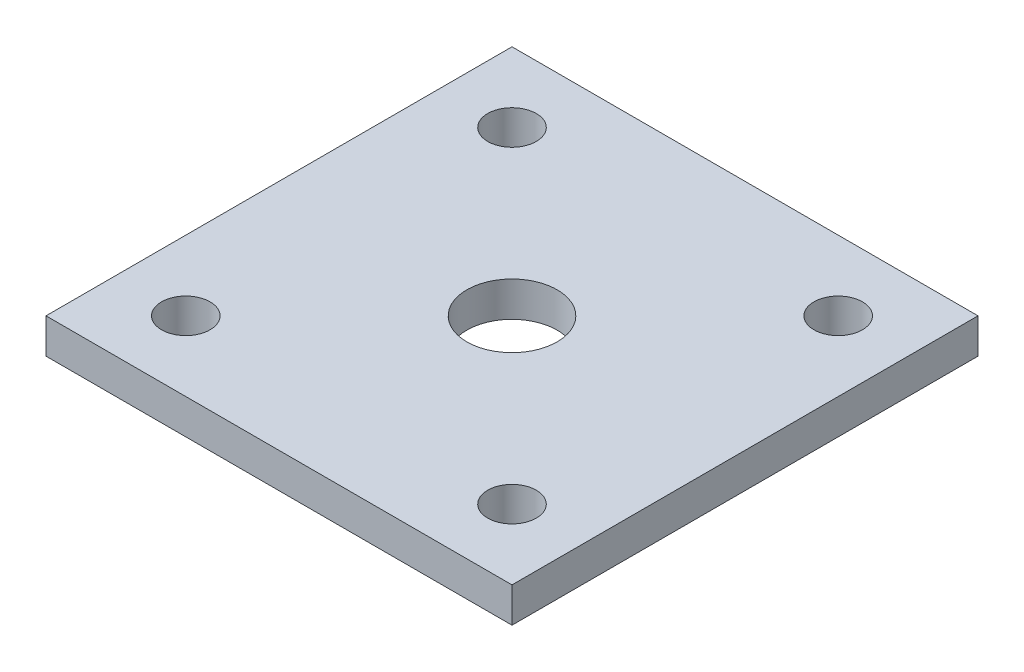
ISO-10303-21;
HEADER;
FILE_DESCRIPTION(('STEP AP214'),'2;1');
FILE_NAME('part.step','',(''),(''),'','','');
FILE_SCHEMA(('AUTOMOTIVE_DESIGN { 1 0 10303 214 1 1 1 1 }'));
ENDSEC;
DATA;
#1=APPLICATION_CONTEXT('core data for automotive mechanical design processes');
#2=APPLICATION_PROTOCOL_DEFINITION('international standard','automotive_design',2000,#1);
#3=PRODUCT_CONTEXT('',#1,'mechanical');
#4=PRODUCT('Part','Part','',(#3));
#5=PRODUCT_RELATED_PRODUCT_CATEGORY('part','',(#4));
#6=PRODUCT_DEFINITION_FORMATION('','',#4);
#7=PRODUCT_DEFINITION_CONTEXT('part definition',#1,'design');
#8=PRODUCT_DEFINITION('design','',#6,#7);
#9=PRODUCT_DEFINITION_SHAPE('','',#8);
#10=(LENGTH_UNIT() NAMED_UNIT(*) SI_UNIT(.MILLI.,.METRE.));
#11=(NAMED_UNIT(*) PLANE_ANGLE_UNIT() SI_UNIT($,.RADIAN.));
#12=(NAMED_UNIT(*) SI_UNIT($,.STERADIAN.) SOLID_ANGLE_UNIT());
#13=UNCERTAINTY_MEASURE_WITH_UNIT(LENGTH_MEASURE(1.E-05),#10,'distance_accuracy_value','');
#14=(GEOMETRIC_REPRESENTATION_CONTEXT(3) GLOBAL_UNCERTAINTY_ASSIGNED_CONTEXT((#13)) GLOBAL_UNIT_ASSIGNED_CONTEXT((#10,
#11,#12)) REPRESENTATION_CONTEXT('',''));
#15=CARTESIAN_POINT('',(0.,0.,0.));
#16=DIRECTION('',(0.,0.,1.));
#17=DIRECTION('',(1.,0.,0.));
#18=AXIS2_PLACEMENT_3D('',#15,#16,#17);
#19=CARTESIAN_POINT('',(0.,3.,0.));
#20=DIRECTION('',(0.,-1.,0.));
#21=DIRECTION('',(0.,0.,-1.));
#22=AXIS2_PLACEMENT_3D('',#19,#20,#21);
#23=PLANE('',#22);
#24=CARTESIAN_POINT('',(34.,3.,-6.));
#25=DIRECTION('',(0.,1.,0.));
#26=DIRECTION('',(0.,0.,1.));
#27=AXIS2_PLACEMENT_3D('',#24,#25,#26);
#28=CIRCLE('',#27,2.0828);
#29=CARTESIAN_POINT('',(34.,3.,-3.9172));
#30=VERTEX_POINT('',#29);
#31=EDGE_CURVE('E126',#30,#30,#28,.T.);
#32=ORIENTED_EDGE('',*,*,#31,.F.);
#33=EDGE_LOOP('',(#32));
#34=FACE_BOUND('',#33,.T.);
#35=CARTESIAN_POINT('',(6.,3.,-34.));
#36=DIRECTION('',(0.,1.,0.));
#37=DIRECTION('',(0.,0.,1.));
#38=AXIS2_PLACEMENT_3D('',#35,#36,#37);
#39=CIRCLE('',#38,2.0828);
#40=CARTESIAN_POINT('',(6.,3.,-31.9172));
#41=VERTEX_POINT('',#40);
#42=EDGE_CURVE('E114',#41,#41,#39,.T.);
#43=ORIENTED_EDGE('',*,*,#42,.F.);
#44=EDGE_LOOP('',(#43));
#45=FACE_BOUND('',#44,.T.);
#46=DIRECTION('',(0.,0.,1.));
#47=VECTOR('',#46,1.);
#48=CARTESIAN_POINT('',(0.,3.,0.));
#49=LINE('',#48,#47);
#50=CARTESIAN_POINT('',(0.,3.,-40.));
#51=VERTEX_POINT('',#50);
#52=CARTESIAN_POINT('',(0.,3.,0.));
#53=VERTEX_POINT('',#52);
#54=EDGE_CURVE('E84',#51,#53,#49,.T.);
#55=ORIENTED_EDGE('',*,*,#54,.T.);
#56=DIRECTION('',(1.,0.,0.));
#57=VECTOR('',#56,1.);
#58=CARTESIAN_POINT('',(0.,3.,0.));
#59=LINE('',#58,#57);
#60=CARTESIAN_POINT('',(40.,3.,0.));
#61=VERTEX_POINT('',#60);
#62=EDGE_CURVE('E79',#53,#61,#59,.T.);
#63=ORIENTED_EDGE('',*,*,#62,.T.);
#64=DIRECTION('',(0.,0.,-1.));
#65=VECTOR('',#64,1.);
#66=CARTESIAN_POINT('',(40.,3.,0.));
#67=LINE('',#66,#65);
#68=CARTESIAN_POINT('',(40.,3.,-40.));
#69=VERTEX_POINT('',#68);
#70=EDGE_CURVE('E82',#61,#69,#67,.T.);
#71=ORIENTED_EDGE('',*,*,#70,.T.);
#72=DIRECTION('',(-1.,0.,0.));
#73=VECTOR('',#72,1.);
#74=CARTESIAN_POINT('',(0.,3.,-40.));
#75=LINE('',#74,#73);
#76=EDGE_CURVE('E49',#69,#51,#75,.T.);
#77=ORIENTED_EDGE('',*,*,#76,.T.);
#78=EDGE_LOOP('',(#55,#63,#71,#77));
#79=FACE_BOUND('',#78,.T.);
#80=CARTESIAN_POINT('',(20.,3.,-20.));
#81=DIRECTION('',(0.,1.,0.));
#82=DIRECTION('',(0.,0.,1.));
#83=AXIS2_PLACEMENT_3D('',#80,#81,#82);
#84=CIRCLE('',#83,3.875);
#85=CARTESIAN_POINT('',(20.,3.,-16.125));
#86=VERTEX_POINT('',#85);
#87=EDGE_CURVE('E99',#86,#86,#84,.T.);
#88=ORIENTED_EDGE('',*,*,#87,.F.);
#89=EDGE_LOOP('',(#88));
#90=FACE_BOUND('',#89,.T.);
#91=CARTESIAN_POINT('',(6.,3.,-6.));
#92=DIRECTION('',(0.,1.,0.));
#93=DIRECTION('',(0.,0.,1.));
#94=AXIS2_PLACEMENT_3D('',#91,#92,#93);
#95=CIRCLE('',#94,2.0828);
#96=CARTESIAN_POINT('',(6.,3.,-3.9172));
#97=VERTEX_POINT('',#96);
#98=EDGE_CURVE('E120',#97,#97,#95,.T.);
#99=ORIENTED_EDGE('',*,*,#98,.F.);
#100=EDGE_LOOP('',(#99));
#101=FACE_BOUND('',#100,.T.);
#102=CARTESIAN_POINT('',(34.,3.,-34.));
#103=DIRECTION('',(0.,1.,0.));
#104=DIRECTION('',(0.,0.,1.));
#105=AXIS2_PLACEMENT_3D('',#102,#103,#104);
#106=CIRCLE('',#105,2.0828);
#107=CARTESIAN_POINT('',(34.,3.,-31.9172));
#108=VERTEX_POINT('',#107);
#109=EDGE_CURVE('E132',#108,#108,#106,.T.);
#110=ORIENTED_EDGE('',*,*,#109,.F.);
#111=EDGE_LOOP('',(#110));
#112=FACE_BOUND('',#111,.T.);
#113=ADVANCED_FACE('F32',(#34,#45,#79,#90,#101,#112),#23,.F.);
#114=CARTESIAN_POINT('',(0.,0.,0.));
#115=DIRECTION('',(0.,-1.,0.));
#116=DIRECTION('',(0.,0.,-1.));
#117=AXIS2_PLACEMENT_3D('',#114,#115,#116);
#118=PLANE('',#117);
#119=CARTESIAN_POINT('',(34.,0.,-6.));
#120=DIRECTION('',(0.,1.,0.));
#121=DIRECTION('',(0.,0.,1.));
#122=AXIS2_PLACEMENT_3D('',#119,#120,#121);
#123=CIRCLE('',#122,2.0828);
#124=CARTESIAN_POINT('',(34.,0.,-3.9172));
#125=VERTEX_POINT('',#124);
#126=EDGE_CURVE('E129',#125,#125,#123,.T.);
#127=ORIENTED_EDGE('',*,*,#126,.T.);
#128=EDGE_LOOP('',(#127));
#129=FACE_BOUND('',#128,.T.);
#130=CARTESIAN_POINT('',(6.,0.,-34.));
#131=DIRECTION('',(0.,1.,0.));
#132=DIRECTION('',(0.,0.,1.));
#133=AXIS2_PLACEMENT_3D('',#130,#131,#132);
#134=CIRCLE('',#133,2.0828);
#135=CARTESIAN_POINT('',(6.,0.,-31.9172));
#136=VERTEX_POINT('',#135);
#137=EDGE_CURVE('E117',#136,#136,#134,.T.);
#138=ORIENTED_EDGE('',*,*,#137,.T.);
#139=EDGE_LOOP('',(#138));
#140=FACE_BOUND('',#139,.T.);
#141=DIRECTION('',(0.,0.,1.));
#142=VECTOR('',#141,1.);
#143=CARTESIAN_POINT('',(0.,0.,0.));
#144=LINE('',#143,#142);
#145=CARTESIAN_POINT('',(0.,0.,-40.));
#146=VERTEX_POINT('',#145);
#147=CARTESIAN_POINT('',(0.,0.,0.));
#148=VERTEX_POINT('',#147);
#149=EDGE_CURVE('E96',#146,#148,#144,.T.);
#150=ORIENTED_EDGE('',*,*,#149,.F.);
#151=DIRECTION('',(-1.,0.,0.));
#152=VECTOR('',#151,1.);
#153=CARTESIAN_POINT('',(0.,0.,-40.));
#154=LINE('',#153,#152);
#155=CARTESIAN_POINT('',(40.,0.,-40.));
#156=VERTEX_POINT('',#155);
#157=EDGE_CURVE('E72',#156,#146,#154,.T.);
#158=ORIENTED_EDGE('',*,*,#157,.F.);
#159=DIRECTION('',(0.,0.,-1.));
#160=VECTOR('',#159,1.);
#161=CARTESIAN_POINT('',(40.,0.,0.));
#162=LINE('',#161,#160);
#163=CARTESIAN_POINT('',(40.,0.,0.));
#164=VERTEX_POINT('',#163);
#165=EDGE_CURVE('E66',#164,#156,#162,.T.);
#166=ORIENTED_EDGE('',*,*,#165,.F.);
#167=DIRECTION('',(1.,0.,0.));
#168=VECTOR('',#167,1.);
#169=CARTESIAN_POINT('',(0.,0.,0.));
#170=LINE('',#169,#168);
#171=EDGE_CURVE('E88',#148,#164,#170,.T.);
#172=ORIENTED_EDGE('',*,*,#171,.F.);
#173=EDGE_LOOP('',(#150,#158,#166,#172));
#174=FACE_BOUND('',#173,.T.);
#175=CARTESIAN_POINT('',(20.,0.,-20.));
#176=DIRECTION('',(0.,1.,0.));
#177=DIRECTION('',(0.,0.,1.));
#178=AXIS2_PLACEMENT_3D('',#175,#176,#177);
#179=CIRCLE('',#178,3.875);
#180=CARTESIAN_POINT('',(20.,0.,-16.125));
#181=VERTEX_POINT('',#180);
#182=EDGE_CURVE('E111',#181,#181,#179,.T.);
#183=ORIENTED_EDGE('',*,*,#182,.T.);
#184=EDGE_LOOP('',(#183));
#185=FACE_BOUND('',#184,.T.);
#186=CARTESIAN_POINT('',(6.,0.,-6.));
#187=DIRECTION('',(0.,1.,0.));
#188=DIRECTION('',(0.,0.,1.));
#189=AXIS2_PLACEMENT_3D('',#186,#187,#188);
#190=CIRCLE('',#189,2.0828);
#191=CARTESIAN_POINT('',(6.,0.,-3.9172));
#192=VERTEX_POINT('',#191);
#193=EDGE_CURVE('E123',#192,#192,#190,.T.);
#194=ORIENTED_EDGE('',*,*,#193,.T.);
#195=EDGE_LOOP('',(#194));
#196=FACE_BOUND('',#195,.T.);
#197=CARTESIAN_POINT('',(34.,0.,-34.));
#198=DIRECTION('',(0.,1.,0.));
#199=DIRECTION('',(0.,0.,1.));
#200=AXIS2_PLACEMENT_3D('',#197,#198,#199);
#201=CIRCLE('',#200,2.0828);
#202=CARTESIAN_POINT('',(34.,0.,-31.9172));
#203=VERTEX_POINT('',#202);
#204=EDGE_CURVE('E135',#203,#203,#201,.T.);
#205=ORIENTED_EDGE('',*,*,#204,.T.);
#206=EDGE_LOOP('',(#205));
#207=FACE_BOUND('',#206,.T.);
#208=ADVANCED_FACE('F107',(#129,#140,#174,#185,#196,#207),#118,.T.);
#209=CARTESIAN_POINT('',(0.,3.,0.));
#210=DIRECTION('',(1.,0.,0.));
#211=DIRECTION('',(0.,0.,-1.));
#212=AXIS2_PLACEMENT_3D('',#209,#210,#211);
#213=PLANE('',#212);
#214=ORIENTED_EDGE('',*,*,#149,.T.);
#215=DIRECTION('',(0.,-1.,0.));
#216=VECTOR('',#215,1.);
#217=CARTESIAN_POINT('',(0.,3.,0.));
#218=LINE('',#217,#216);
#219=EDGE_CURVE('E11',#53,#148,#218,.T.);
#220=ORIENTED_EDGE('',*,*,#219,.F.);
#221=ORIENTED_EDGE('',*,*,#54,.F.);
#222=DIRECTION('',(0.,-1.,0.));
#223=VECTOR('',#222,1.);
#224=CARTESIAN_POINT('',(0.,3.,-40.));
#225=LINE('',#224,#223);
#226=EDGE_CURVE('E92',#51,#146,#225,.T.);
#227=ORIENTED_EDGE('',*,*,#226,.T.);
#228=EDGE_LOOP('',(#214,#220,#221,#227));
#229=FACE_BOUND('',#228,.T.);
#230=ADVANCED_FACE('F34',(#229),#213,.F.);
#231=CARTESIAN_POINT('',(0.,3.,0.));
#232=DIRECTION('',(0.,0.,-1.));
#233=DIRECTION('',(-1.,0.,0.));
#234=AXIS2_PLACEMENT_3D('',#231,#232,#233);
#235=PLANE('',#234);
#236=ORIENTED_EDGE('',*,*,#171,.T.);
#237=DIRECTION('',(0.,-1.,0.));
#238=VECTOR('',#237,1.);
#239=CARTESIAN_POINT('',(40.,3.,0.));
#240=LINE('',#239,#238);
#241=EDGE_CURVE('E41',#61,#164,#240,.T.);
#242=ORIENTED_EDGE('',*,*,#241,.F.);
#243=ORIENTED_EDGE('',*,*,#62,.F.);
#244=ORIENTED_EDGE('',*,*,#219,.T.);
#245=EDGE_LOOP('',(#236,#242,#243,#244));
#246=FACE_BOUND('',#245,.T.);
#247=ADVANCED_FACE('F87',(#246),#235,.F.);
#248=CARTESIAN_POINT('',(40.,3.,0.));
#249=DIRECTION('',(-1.,0.,0.));
#250=DIRECTION('',(0.,0.,1.));
#251=AXIS2_PLACEMENT_3D('',#248,#249,#250);
#252=PLANE('',#251);
#253=ORIENTED_EDGE('',*,*,#165,.T.);
#254=DIRECTION('',(0.,-1.,0.));
#255=VECTOR('',#254,1.);
#256=CARTESIAN_POINT('',(40.,3.,-40.));
#257=LINE('',#256,#255);
#258=EDGE_CURVE('E89',#69,#156,#257,.T.);
#259=ORIENTED_EDGE('',*,*,#258,.F.);
#260=ORIENTED_EDGE('',*,*,#70,.F.);
#261=ORIENTED_EDGE('',*,*,#241,.T.);
#262=EDGE_LOOP('',(#253,#259,#260,#261));
#263=FACE_BOUND('',#262,.T.);
#264=ADVANCED_FACE('F90',(#263),#252,.F.);
#265=CARTESIAN_POINT('',(0.,3.,-40.));
#266=DIRECTION('',(0.,0.,1.));
#267=DIRECTION('',(1.,0.,0.));
#268=AXIS2_PLACEMENT_3D('',#265,#266,#267);
#269=PLANE('',#268);
#270=ORIENTED_EDGE('',*,*,#157,.T.);
#271=ORIENTED_EDGE('',*,*,#226,.F.);
#272=ORIENTED_EDGE('',*,*,#76,.F.);
#273=ORIENTED_EDGE('',*,*,#258,.T.);
#274=EDGE_LOOP('',(#270,#271,#272,#273));
#275=FACE_BOUND('',#274,.T.);
#276=ADVANCED_FACE('F104',(#275),#269,.F.);
#277=CARTESIAN_POINT('',(20.,3.,-20.));
#278=DIRECTION('',(0.,-1.,0.));
#279=DIRECTION('',(0.,0.,-1.));
#280=AXIS2_PLACEMENT_3D('',#277,#278,#279);
#281=CYLINDRICAL_SURFACE('',#280,3.875);
#282=ORIENTED_EDGE('',*,*,#87,.T.);
#283=EDGE_LOOP('',(#282));
#284=FACE_BOUND('',#283,.T.);
#285=ORIENTED_EDGE('',*,*,#182,.F.);
#286=EDGE_LOOP('',(#285));
#287=FACE_BOUND('',#286,.T.);
#288=ADVANCED_FACE('F155',(#284,#287),#281,.F.);
#289=CARTESIAN_POINT('',(6.,3.,-34.));
#290=DIRECTION('',(0.,-1.,0.));
#291=DIRECTION('',(0.,0.,-1.));
#292=AXIS2_PLACEMENT_3D('',#289,#290,#291);
#293=CYLINDRICAL_SURFACE('',#292,2.0828);
#294=ORIENTED_EDGE('',*,*,#42,.T.);
#295=EDGE_LOOP('',(#294));
#296=FACE_BOUND('',#295,.T.);
#297=ORIENTED_EDGE('',*,*,#137,.F.);
#298=EDGE_LOOP('',(#297));
#299=FACE_BOUND('',#298,.T.);
#300=ADVANCED_FACE('F201',(#296,#299),#293,.F.);
#301=CARTESIAN_POINT('',(6.,3.,-6.));
#302=DIRECTION('',(0.,-1.,0.));
#303=DIRECTION('',(0.,0.,-1.));
#304=AXIS2_PLACEMENT_3D('',#301,#302,#303);
#305=CYLINDRICAL_SURFACE('',#304,2.0828);
#306=ORIENTED_EDGE('',*,*,#98,.T.);
#307=EDGE_LOOP('',(#306));
#308=FACE_BOUND('',#307,.T.);
#309=ORIENTED_EDGE('',*,*,#193,.F.);
#310=EDGE_LOOP('',(#309));
#311=FACE_BOUND('',#310,.T.);
#312=ADVANCED_FACE('F209',(#308,#311),#305,.F.);
#313=CARTESIAN_POINT('',(34.,3.,-6.));
#314=DIRECTION('',(0.,-1.,0.));
#315=DIRECTION('',(0.,0.,-1.));
#316=AXIS2_PLACEMENT_3D('',#313,#314,#315);
#317=CYLINDRICAL_SURFACE('',#316,2.0828);
#318=ORIENTED_EDGE('',*,*,#31,.T.);
#319=EDGE_LOOP('',(#318));
#320=FACE_BOUND('',#319,.T.);
#321=ORIENTED_EDGE('',*,*,#126,.F.);
#322=EDGE_LOOP('',(#321));
#323=FACE_BOUND('',#322,.T.);
#324=ADVANCED_FACE('F217',(#320,#323),#317,.F.);
#325=CARTESIAN_POINT('',(34.,3.,-34.));
#326=DIRECTION('',(0.,-1.,0.));
#327=DIRECTION('',(0.,0.,-1.));
#328=AXIS2_PLACEMENT_3D('',#325,#326,#327);
#329=CYLINDRICAL_SURFACE('',#328,2.0828);
#330=ORIENTED_EDGE('',*,*,#109,.T.);
#331=EDGE_LOOP('',(#330));
#332=FACE_BOUND('',#331,.T.);
#333=ORIENTED_EDGE('',*,*,#204,.F.);
#334=EDGE_LOOP('',(#333));
#335=FACE_BOUND('',#334,.T.);
#336=ADVANCED_FACE('F141',(#332,#335),#329,.F.);
#337=CLOSED_SHELL('',(#113,#208,#230,#247,#264,#276,#288,#300,#312,#324,#336));
#338=MANIFOLD_SOLID_BREP('B2',#337);
#339=ADVANCED_BREP_SHAPE_REPRESENTATION('',(#18,#338),#14);
#340=SHAPE_DEFINITION_REPRESENTATION(#9,#339);
ENDSEC;
END-ISO-10303-21;
